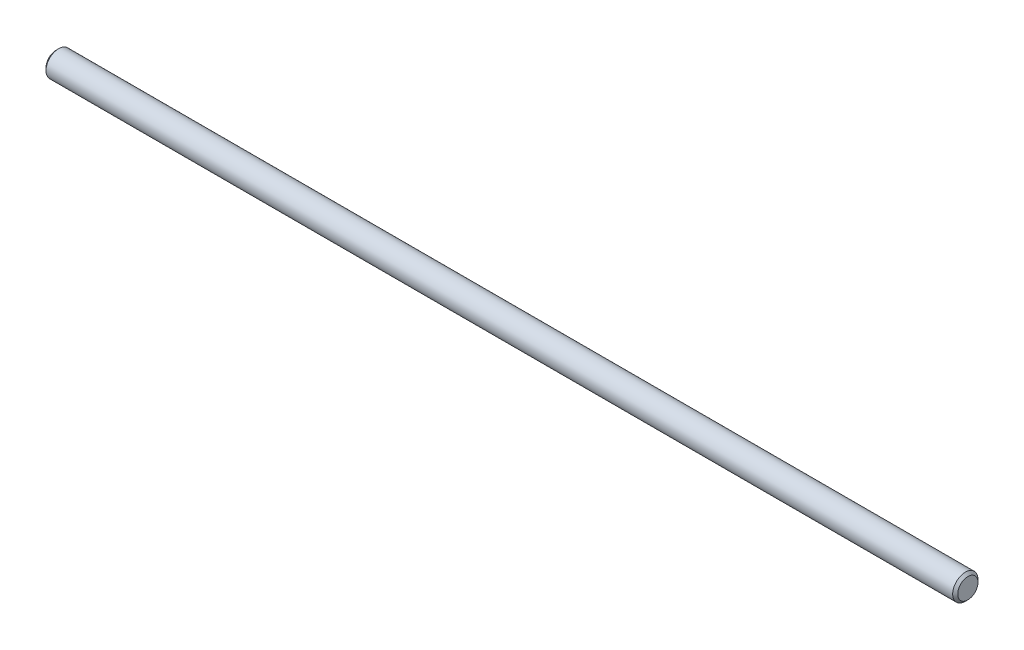
ISO-10303-21;
HEADER;
FILE_DESCRIPTION(('STEP AP214'),'2;1');
FILE_NAME('part.step','',(''),(''),'','','');
FILE_SCHEMA(('AUTOMOTIVE_DESIGN { 1 0 10303 214 1 1 1 1 }'));
ENDSEC;
DATA;
#1=APPLICATION_CONTEXT('core data for automotive mechanical design processes');
#2=APPLICATION_PROTOCOL_DEFINITION('international standard','automotive_design',2000,#1);
#3=PRODUCT_CONTEXT('',#1,'mechanical');
#4=PRODUCT('Part','Part','',(#3));
#5=PRODUCT_RELATED_PRODUCT_CATEGORY('part','',(#4));
#6=PRODUCT_DEFINITION_FORMATION('','',#4);
#7=PRODUCT_DEFINITION_CONTEXT('part definition',#1,'design');
#8=PRODUCT_DEFINITION('design','',#6,#7);
#9=PRODUCT_DEFINITION_SHAPE('','',#8);
#10=(LENGTH_UNIT() NAMED_UNIT(*) SI_UNIT(.MILLI.,.METRE.));
#11=(NAMED_UNIT(*) PLANE_ANGLE_UNIT() SI_UNIT($,.RADIAN.));
#12=(NAMED_UNIT(*) SI_UNIT($,.STERADIAN.) SOLID_ANGLE_UNIT());
#13=UNCERTAINTY_MEASURE_WITH_UNIT(LENGTH_MEASURE(1.E-05),#10,'distance_accuracy_value','');
#14=(GEOMETRIC_REPRESENTATION_CONTEXT(3) GLOBAL_UNCERTAINTY_ASSIGNED_CONTEXT((#13)) GLOBAL_UNIT_ASSIGNED_CONTEXT((#10,
#11,#12)) REPRESENTATION_CONTEXT('',''));
#15=CARTESIAN_POINT('',(0.,0.,0.));
#16=DIRECTION('',(0.,0.,1.));
#17=DIRECTION('',(1.,0.,0.));
#18=AXIS2_PLACEMENT_3D('',#15,#16,#17);
#19=CARTESIAN_POINT('',(-114.3,0.,0.));
#20=DIRECTION('',(1.,0.,0.));
#21=DIRECTION('',(0.,0.,-1.));
#22=AXIS2_PLACEMENT_3D('',#19,#20,#21);
#23=CYLINDRICAL_SURFACE('',#22,3.175);
#24=CARTESIAN_POINT('',(113.665,0.,0.));
#25=DIRECTION('',(1.,0.,0.));
#26=DIRECTION('',(0.,0.,-1.));
#27=AXIS2_PLACEMENT_3D('',#24,#25,#26);
#28=CIRCLE('',#27,3.175);
#29=CARTESIAN_POINT('',(113.665,0.,-3.175));
#30=VERTEX_POINT('',#29);
#31=EDGE_CURVE('E39',#30,#30,#28,.F.);
#32=ORIENTED_EDGE('',*,*,#31,.T.);
#33=EDGE_LOOP('',(#32));
#34=FACE_BOUND('',#33,.T.);
#35=CARTESIAN_POINT('',(-113.665,0.,0.));
#36=DIRECTION('',(1.,0.,0.));
#37=DIRECTION('',(0.,0.,-1.));
#38=AXIS2_PLACEMENT_3D('',#35,#36,#37);
#39=CIRCLE('',#38,3.175);
#40=CARTESIAN_POINT('',(-113.665,0.,-3.175));
#41=VERTEX_POINT('',#40);
#42=EDGE_CURVE('E43',#41,#41,#39,.T.);
#43=ORIENTED_EDGE('',*,*,#42,.T.);
#44=EDGE_LOOP('',(#43));
#45=FACE_BOUND('',#44,.T.);
#46=ADVANCED_FACE('F32',(#34,#45),#23,.T.);
#47=CARTESIAN_POINT('',(-114.3,0.,0.));
#48=DIRECTION('',(1.,0.,0.));
#49=DIRECTION('',(0.,0.,-1.));
#50=AXIS2_PLACEMENT_3D('',#47,#48,#49);
#51=PLANE('',#50);
#52=CARTESIAN_POINT('',(-114.3,0.,0.));
#53=DIRECTION('',(1.,0.,0.));
#54=DIRECTION('',(0.,0.,-1.));
#55=AXIS2_PLACEMENT_3D('',#52,#53,#54);
#56=CIRCLE('',#55,2.53999999999999);
#57=CARTESIAN_POINT('',(-114.3,0.,-2.53999999999999));
#58=VERTEX_POINT('',#57);
#59=EDGE_CURVE('E10',#58,#58,#56,.F.);
#60=ORIENTED_EDGE('',*,*,#59,.T.);
#61=EDGE_LOOP('',(#60));
#62=FACE_BOUND('',#61,.T.);
#63=ADVANCED_FACE('F63',(#62),#51,.F.);
#64=CARTESIAN_POINT('',(114.3,0.,0.));
#65=DIRECTION('',(1.,0.,0.));
#66=DIRECTION('',(0.,0.,-1.));
#67=AXIS2_PLACEMENT_3D('',#64,#65,#66);
#68=PLANE('',#67);
#69=CARTESIAN_POINT('',(114.3,0.,0.));
#70=DIRECTION('',(1.,0.,0.));
#71=DIRECTION('',(0.,0.,-1.));
#72=AXIS2_PLACEMENT_3D('',#69,#70,#71);
#73=CIRCLE('',#72,2.54000000000004);
#74=CARTESIAN_POINT('',(114.3,0.,-2.54000000000004));
#75=VERTEX_POINT('',#74);
#76=EDGE_CURVE('E47',#75,#75,#73,.T.);
#77=ORIENTED_EDGE('',*,*,#76,.T.);
#78=EDGE_LOOP('',(#77));
#79=FACE_BOUND('',#78,.T.);
#80=ADVANCED_FACE('F53',(#79),#68,.T.);
#81=CARTESIAN_POINT('',(114.3,0.,0.));
#82=DIRECTION('',(-1.,0.,0.));
#83=DIRECTION('',(0.,0.,1.));
#84=AXIS2_PLACEMENT_3D('',#81,#82,#83);
#85=CONICAL_SURFACE('',#84,2.54000000000004,0.78539816339744);
#86=ORIENTED_EDGE('',*,*,#31,.F.);
#87=EDGE_LOOP('',(#86));
#88=FACE_BOUND('',#87,.T.);
#89=ORIENTED_EDGE('',*,*,#76,.F.);
#90=EDGE_LOOP('',(#89));
#91=FACE_BOUND('',#90,.T.);
#92=ADVANCED_FACE('F55',(#88,#91),#85,.T.);
#93=CARTESIAN_POINT('',(-113.665,0.,0.));
#94=DIRECTION('',(1.,0.,0.));
#95=DIRECTION('',(0.,0.,-1.));
#96=AXIS2_PLACEMENT_3D('',#93,#94,#95);
#97=CONICAL_SURFACE('',#96,3.175,0.78539816339744);
#98=ORIENTED_EDGE('',*,*,#59,.F.);
#99=EDGE_LOOP('',(#98));
#100=FACE_BOUND('',#99,.T.);
#101=ORIENTED_EDGE('',*,*,#42,.F.);
#102=EDGE_LOOP('',(#101));
#103=FACE_BOUND('',#102,.T.);
#104=ADVANCED_FACE('F34',(#100,#103),#97,.T.);
#105=CLOSED_SHELL('',(#46,#63,#80,#92,#104));
#106=MANIFOLD_SOLID_BREP('B2',#105);
#107=ADVANCED_BREP_SHAPE_REPRESENTATION('',(#18,#106),#14);
#108=SHAPE_DEFINITION_REPRESENTATION(#9,#107);
ENDSEC;
END-ISO-10303-21;
